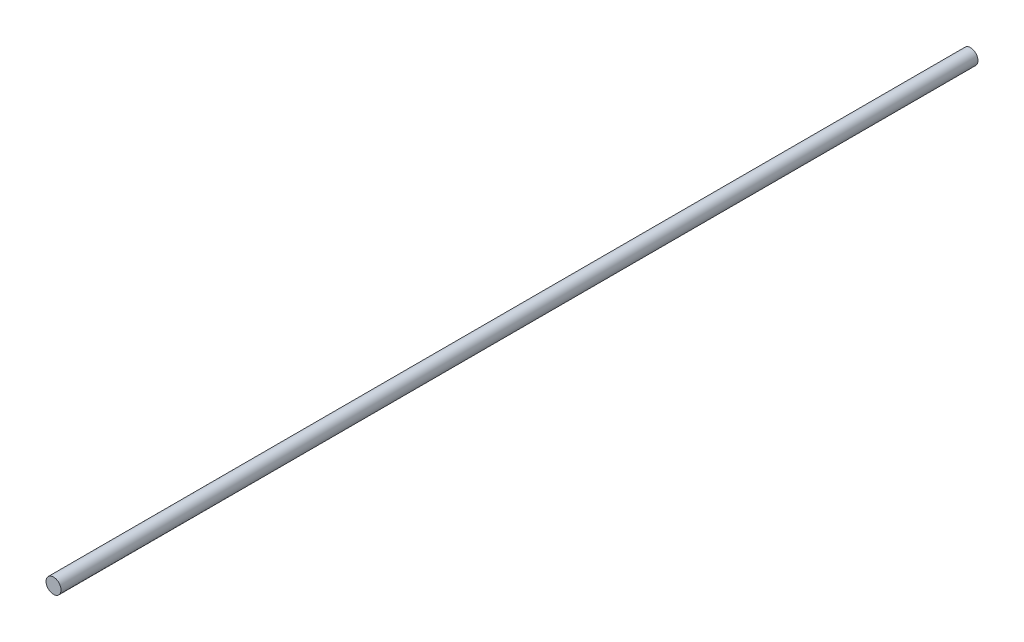
ISO-10303-21;
HEADER;
FILE_DESCRIPTION(('STEP AP214'),'2;1');
FILE_NAME('part.step','',(''),(''),'','','');
FILE_SCHEMA(('AUTOMOTIVE_DESIGN { 1 0 10303 214 1 1 1 1 }'));
ENDSEC;
DATA;
#1=APPLICATION_CONTEXT('core data for automotive mechanical design processes');
#2=APPLICATION_PROTOCOL_DEFINITION('international standard','automotive_design',2000,#1);
#3=PRODUCT_CONTEXT('',#1,'mechanical');
#4=PRODUCT('Part','Part','',(#3));
#5=PRODUCT_RELATED_PRODUCT_CATEGORY('part','',(#4));
#6=PRODUCT_DEFINITION_FORMATION('','',#4);
#7=PRODUCT_DEFINITION_CONTEXT('part definition',#1,'design');
#8=PRODUCT_DEFINITION('design','',#6,#7);
#9=PRODUCT_DEFINITION_SHAPE('','',#8);
#10=(LENGTH_UNIT() NAMED_UNIT(*) SI_UNIT(.MILLI.,.METRE.));
#11=(NAMED_UNIT(*) PLANE_ANGLE_UNIT() SI_UNIT($,.RADIAN.));
#12=(NAMED_UNIT(*) SI_UNIT($,.STERADIAN.) SOLID_ANGLE_UNIT());
#13=UNCERTAINTY_MEASURE_WITH_UNIT(LENGTH_MEASURE(1.E-05),#10,'distance_accuracy_value','');
#14=(GEOMETRIC_REPRESENTATION_CONTEXT(3) GLOBAL_UNCERTAINTY_ASSIGNED_CONTEXT((#13)) GLOBAL_UNIT_ASSIGNED_CONTEXT((#10,
#11,#12)) REPRESENTATION_CONTEXT('',''));
#15=CARTESIAN_POINT('',(0.,0.,0.));
#16=DIRECTION('',(0.,0.,1.));
#17=DIRECTION('',(1.,0.,0.));
#18=AXIS2_PLACEMENT_3D('',#15,#16,#17);
#19=CARTESIAN_POINT('',(0.,0.,610.));
#20=DIRECTION('',(0.,0.,-1.));
#21=DIRECTION('',(-1.,0.,0.));
#22=AXIS2_PLACEMENT_3D('',#19,#20,#21);
#23=CYLINDRICAL_SURFACE('',#22,5.);
#24=CARTESIAN_POINT('',(0.,0.,610.));
#25=DIRECTION('',(0.,0.,1.));
#26=DIRECTION('',(1.,0.,0.));
#27=AXIS2_PLACEMENT_3D('',#24,#25,#26);
#28=CIRCLE('',#27,5.);
#29=CARTESIAN_POINT('',(5.,0.,610.));
#30=VERTEX_POINT('',#29);
#31=EDGE_CURVE('E10',#30,#30,#28,.T.);
#32=ORIENTED_EDGE('',*,*,#31,.F.);
#33=EDGE_LOOP('',(#32));
#34=FACE_BOUND('',#33,.T.);
#35=CARTESIAN_POINT('',(0.,0.,0.));
#36=DIRECTION('',(0.,0.,1.));
#37=DIRECTION('',(1.,0.,0.));
#38=AXIS2_PLACEMENT_3D('',#35,#36,#37);
#39=CIRCLE('',#38,5.);
#40=CARTESIAN_POINT('',(5.,0.,0.));
#41=VERTEX_POINT('',#40);
#42=EDGE_CURVE('E37',#41,#41,#39,.T.);
#43=ORIENTED_EDGE('',*,*,#42,.T.);
#44=EDGE_LOOP('',(#43));
#45=FACE_BOUND('',#44,.T.);
#46=ADVANCED_FACE('F34',(#34,#45),#23,.T.);
#47=CARTESIAN_POINT('',(0.,0.,610.));
#48=DIRECTION('',(0.,0.,1.));
#49=DIRECTION('',(1.,0.,0.));
#50=AXIS2_PLACEMENT_3D('',#47,#48,#49);
#51=PLANE('',#50);
#52=ORIENTED_EDGE('',*,*,#31,.T.);
#53=EDGE_LOOP('',(#52));
#54=FACE_BOUND('',#53,.T.);
#55=ADVANCED_FACE('F49',(#54),#51,.T.);
#56=CARTESIAN_POINT('',(0.,0.,0.));
#57=DIRECTION('',(0.,0.,1.));
#58=DIRECTION('',(1.,0.,0.));
#59=AXIS2_PLACEMENT_3D('',#56,#57,#58);
#60=PLANE('',#59);
#61=ORIENTED_EDGE('',*,*,#42,.F.);
#62=EDGE_LOOP('',(#61));
#63=FACE_BOUND('',#62,.T.);
#64=ADVANCED_FACE('F47',(#63),#60,.F.);
#65=CLOSED_SHELL('',(#46,#55,#64));
#66=MANIFOLD_SOLID_BREP('B2',#65);
#67=ADVANCED_BREP_SHAPE_REPRESENTATION('',(#18,#66),#14);
#68=SHAPE_DEFINITION_REPRESENTATION(#9,#67);
ENDSEC;
END-ISO-10303-21;
